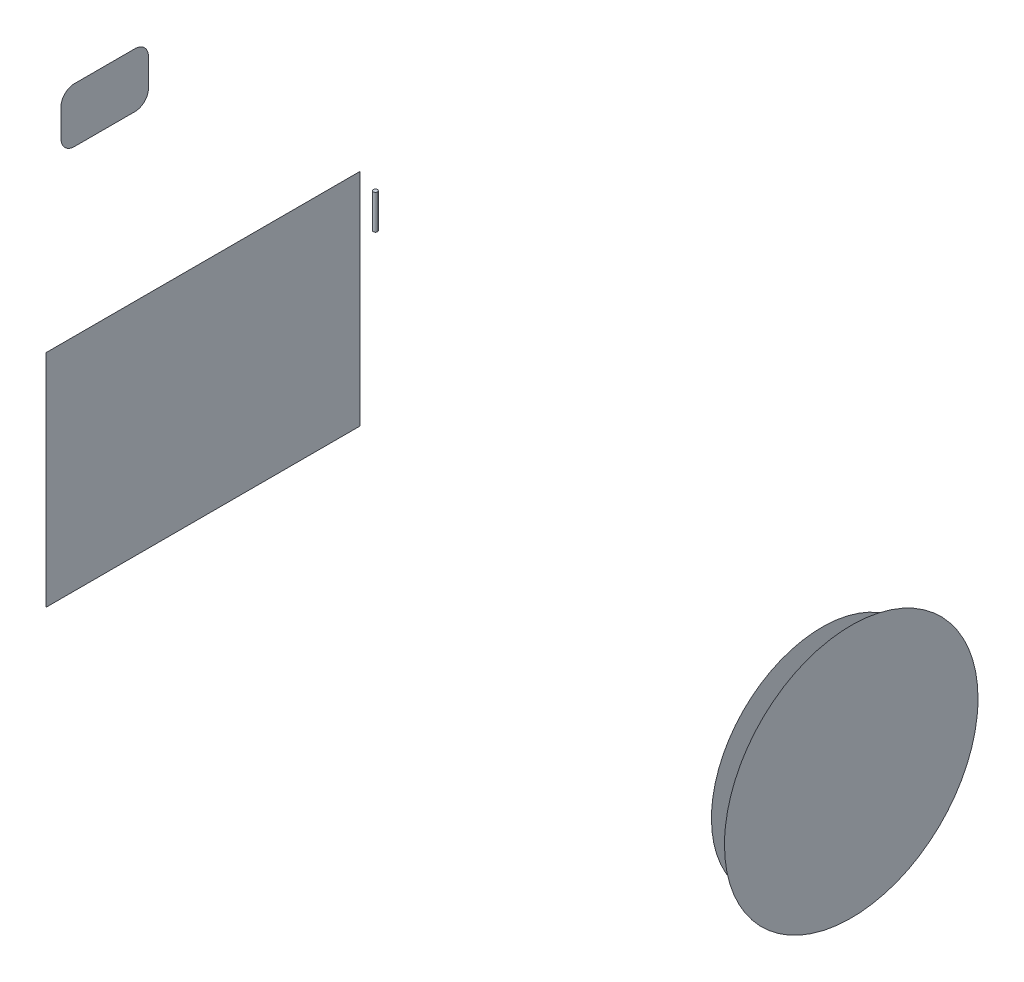
ISO-10303-21;
HEADER;
FILE_DESCRIPTION(('STEP AP214'),'2;1');
FILE_NAME('part.step','',(''),(''),'','','');
FILE_SCHEMA(('AUTOMOTIVE_DESIGN { 1 0 10303 214 1 1 1 1 }'));
ENDSEC;
DATA;
#1=APPLICATION_CONTEXT('core data for automotive mechanical design processes');
#2=APPLICATION_PROTOCOL_DEFINITION('international standard','automotive_design',2000,#1);
#3=PRODUCT_CONTEXT('',#1,'mechanical');
#4=PRODUCT('Part','Part','',(#3));
#5=PRODUCT_RELATED_PRODUCT_CATEGORY('part','',(#4));
#6=PRODUCT_DEFINITION_FORMATION('','',#4);
#7=PRODUCT_DEFINITION_CONTEXT('part definition',#1,'design');
#8=PRODUCT_DEFINITION('design','',#6,#7);
#9=PRODUCT_DEFINITION_SHAPE('','',#8);
#10=(LENGTH_UNIT() NAMED_UNIT(*) SI_UNIT(.MILLI.,.METRE.));
#11=(NAMED_UNIT(*) PLANE_ANGLE_UNIT() SI_UNIT($,.RADIAN.));
#12=(NAMED_UNIT(*) SI_UNIT($,.STERADIAN.) SOLID_ANGLE_UNIT());
#13=UNCERTAINTY_MEASURE_WITH_UNIT(LENGTH_MEASURE(1.E-05),#10,'distance_accuracy_value','');
#14=(GEOMETRIC_REPRESENTATION_CONTEXT(3) GLOBAL_UNCERTAINTY_ASSIGNED_CONTEXT((#13)) GLOBAL_UNIT_ASSIGNED_CONTEXT((#10,
#11,#12)) REPRESENTATION_CONTEXT('',''));
#15=CARTESIAN_POINT('',(0.,0.,0.));
#16=DIRECTION('',(0.,0.,1.));
#17=DIRECTION('',(1.,0.,0.));
#18=AXIS2_PLACEMENT_3D('',#15,#16,#17);
#19=CARTESIAN_POINT('',(-31.5001634156,30.4644462338,-89.9604729362));
#20=DIRECTION('',(-1.,0.,0.));
#21=DIRECTION('',(0.,-1.,0.));
#22=AXIS2_PLACEMENT_3D('',#19,#20,#21);
#23=PLANE('',#22);
#24=DIRECTION('',(0.,0.,-1.));
#25=VECTOR('',#24,1.);
#26=CARTESIAN_POINT('',(-31.5001634156,30.4644462338,-31.1921359519));
#27=LINE('',#26,#25);
#28=CARTESIAN_POINT('',(-31.5001634156,30.4644462338,27.5762010324));
#29=VERTEX_POINT('',#28);
#30=CARTESIAN_POINT('',(-31.5001634156,30.4644462338,-89.9604729362));
#31=VERTEX_POINT('',#30);
#32=EDGE_CURVE('P0_E24',#29,#31,#27,.T.);
#33=ORIENTED_EDGE('',*,*,#32,.T.);
#34=DIRECTION('',(0.,-1.,0.));
#35=VECTOR('',#34,1.);
#36=CARTESIAN_POINT('',(-31.5001634156,-10.8440817027,-89.9604729362));
#37=LINE('',#36,#35);
#38=CARTESIAN_POINT('',(-31.5001634156,-52.1526096392,-89.9604729362));
#39=VERTEX_POINT('',#38);
#40=EDGE_CURVE('P0_E11',#31,#39,#37,.T.);
#41=ORIENTED_EDGE('',*,*,#40,.T.);
#42=DIRECTION('',(0.,0.,1.));
#43=VECTOR('',#42,1.);
#44=CARTESIAN_POINT('',(-31.5001634156,-52.1526096392,-31.1921359519));
#45=LINE('',#44,#43);
#46=CARTESIAN_POINT('',(-31.5001634156,-52.1526096392,27.5762010324));
#47=VERTEX_POINT('',#46);
#48=EDGE_CURVE('P0_E18',#39,#47,#45,.T.);
#49=ORIENTED_EDGE('',*,*,#48,.T.);
#50=DIRECTION('',(0.,1.,0.));
#51=VECTOR('',#50,1.);
#52=CARTESIAN_POINT('',(-31.5001634156,-10.8440817027,27.5762010324));
#53=LINE('',#52,#51);
#54=EDGE_CURVE('P0_E38',#47,#29,#53,.T.);
#55=ORIENTED_EDGE('',*,*,#54,.T.);
#56=EDGE_LOOP('',(#33,#41,#49,#55));
#57=FACE_BOUND('',#56,.T.);
#58=ADVANCED_FACE('P0_F17',(#57),#23,.T.);
#59=OPEN_SHELL('',(#58));
#60=SHELL_BASED_SURFACE_MODEL('P0_B1',(#59));
#61=CARTESIAN_POINT('',(-32.274944086,21.3204462338,-96.577253632));
#62=DIRECTION('',(0.,-1.,0.));
#63=DIRECTION('',(1.,0.,0.));
#64=AXIS2_PLACEMENT_3D('',#61,#62,#63);
#65=PLANE('',#64);
#66=CARTESIAN_POINT('',(-31.5001634156,21.3204462338,-95.8024729362));
#67=DIRECTION('',(0.,1.,0.));
#68=DIRECTION('',(0.,0.,1.));
#69=AXIS2_PLACEMENT_3D('',#66,#67,#68);
#70=CIRCLE('',#69,0.765593566599998);
#71=CARTESIAN_POINT('',(-31.5001634156,21.3204462338,-95.0368793696));
#72=VERTEX_POINT('',#71);
#73=EDGE_CURVE('P1_E19',#72,#72,#70,.T.);
#74=ORIENTED_EDGE('',*,*,#73,.T.);
#75=EDGE_LOOP('',(#74));
#76=FACE_BOUND('',#75,.T.);
#77=ADVANCED_FACE('P1_F15',(#76),#65,.F.);
#78=CARTESIAN_POINT('',(-32.274944086,8.3664462338,-96.577253632));
#79=DIRECTION('',(0.,-1.,0.));
#80=DIRECTION('',(1.,0.,0.));
#81=AXIS2_PLACEMENT_3D('',#78,#79,#80);
#82=PLANE('',#81);
#83=CARTESIAN_POINT('',(-31.5001634156,8.3664462338,-95.8024729362));
#84=DIRECTION('',(0.,1.,0.));
#85=DIRECTION('',(0.,0.,1.));
#86=AXIS2_PLACEMENT_3D('',#83,#84,#85);
#87=CIRCLE('',#86,0.765593566599998);
#88=CARTESIAN_POINT('',(-31.5001634156,8.3664462338,-95.0368793696));
#89=VERTEX_POINT('',#88);
#90=EDGE_CURVE('P1_E10',#89,#89,#87,.F.);
#91=ORIENTED_EDGE('',*,*,#90,.T.);
#92=EDGE_LOOP('',(#91));
#93=FACE_BOUND('',#92,.T.);
#94=ADVANCED_FACE('P1_F17',(#93),#82,.T.);
#95=CARTESIAN_POINT('',(-31.5001634156,8.3664462338,-95.8024729362));
#96=DIRECTION('',(0.,1.,0.));
#97=DIRECTION('',(0.,0.,1.));
#98=AXIS2_PLACEMENT_3D('',#95,#96,#97);
#99=CYLINDRICAL_SURFACE('',#98,0.765593566599998);
#100=ORIENTED_EDGE('',*,*,#73,.F.);
#101=EDGE_LOOP('',(#100));
#102=FACE_BOUND('',#101,.T.);
#103=ORIENTED_EDGE('',*,*,#90,.F.);
#104=EDGE_LOOP('',(#103));
#105=FACE_BOUND('',#104,.T.);
#106=ADVANCED_FACE('P1_F29',(#102,#105),#99,.T.);
#107=CLOSED_SHELL('',(#77,#94,#106));
#108=MANIFOLD_SOLID_BREP('P1_B1',#107);
#109=CARTESIAN_POINT('',(-54.864,68.629559718,-1.3856896086));
#110=DIRECTION('',(1.,0.,0.));
#111=DIRECTION('',(0.,0.,-1.));
#112=AXIS2_PLACEMENT_3D('',#109,#110,#111);
#113=PLANE('',#112);
#114=CARTESIAN_POINT('',(-54.864,89.0542077688,-6.46568962263782));
#115=CARTESIAN_POINT('',(-54.864,89.0542077688,-5.96562843291567));
#116=CARTESIAN_POINT('',(-54.864,88.9565969868892,-5.47463076399726));
#117=CARTESIAN_POINT('',(-54.864,88.859145031969,-4.98443201995855));
#118=CARTESIAN_POINT('',(-54.864,88.6675157911684,-4.5216577689717));
#119=CARTESIAN_POINT('',(-54.864,88.4763033300983,-4.05989001849006));
#120=CARTESIAN_POINT('',(-54.864,88.1980733928082,-3.64339281669767));
#121=CARTESIAN_POINT('',(-54.864,87.9204486275945,-3.22780152919645));
#122=CARTESIAN_POINT('',(-54.864,87.5663102094185,-2.87358714658831));
#123=CARTESIAN_POINT('',(-54.864,87.2129421234545,-2.52014326143209));
#124=CARTESIAN_POINT('',(-54.864,86.7965045503705,-2.24182397288794));
#125=CARTESIAN_POINT('',(-54.864,86.38097278854,-1.96411006858363));
#126=CARTESIAN_POINT('',(-54.864,85.9182395984487,-1.77238157168807));
#127=CARTESIAN_POINT('',(-54.864,85.4565128780241,-1.5810700946227));
#128=CARTESIAN_POINT('',(-54.864,84.9652665943657,-1.4833003788041));
#129=CARTESIAN_POINT('',(-54.864,84.474818936762,-1.3856896086));
#130=CARTESIAN_POINT('',(-54.864,83.9742077694869,-1.3856896086));
#131=B_SPLINE_CURVE_WITH_KNOTS('',2,(#114,#115,#116,#117,#118,#119,#120,#121,#122,#123,#124,
#125,#126,#127,#128,#129,#130),.UNSPECIFIED.,.F.,.F.,(3,2,2,2,2,2,2,2,3),(0.,0.125,0.25,0.375,
0.5,0.625,0.75,0.875,1.),.UNSPECIFIED.);
#132=CARTESIAN_POINT('',(-54.864,89.0542077688,-6.46568962263782));
#133=VERTEX_POINT('',#132);
#134=CARTESIAN_POINT('',(-54.864,83.9742077694869,-1.3856896086));
#135=VERTEX_POINT('',#134);
#136=EDGE_CURVE('P2_E26',#133,#135,#131,.T.);
#137=ORIENTED_EDGE('',*,*,#136,.T.);
#138=DIRECTION('',(0.,-1.,0.));
#139=VECTOR('',#138,1.);
#140=CARTESIAN_POINT('',(-54.864,78.8418837434,-1.3856896086));
#141=LINE('',#140,#139);
#142=CARTESIAN_POINT('',(-54.864,73.7095597173131,-1.3856896086));
#143=VERTEX_POINT('',#142);
#144=EDGE_CURVE('P2_E11',#135,#143,#141,.T.);
#145=ORIENTED_EDGE('',*,*,#144,.T.);
#146=CARTESIAN_POINT('',(-54.864,73.7095597173131,-1.3856896086));
#147=CARTESIAN_POINT('',(-54.864,73.2094985356016,-1.3856896086));
#148=CARTESIAN_POINT('',(-54.864,72.7185008924344,-1.4833003788041));
#149=CARTESIAN_POINT('',(-54.864,72.2283021665695,-1.5807523235346));
#150=CARTESIAN_POINT('',(-54.864,71.7655278883513,-1.77238157168807));
#151=CARTESIAN_POINT('',(-54.864,71.303760150401,-1.96359402365416));
#152=CARTESIAN_POINT('',(-54.864,70.8872629364295,-2.24182397288794));
#153=CARTESIAN_POINT('',(-54.864,70.4716716264421,-2.51944875692242));
#154=CARTESIAN_POINT('',(-54.864,70.1174572773815,-2.8735871465883));
#155=CARTESIAN_POINT('',(-54.864,69.7640133682248,-3.22695526156698));
#156=CARTESIAN_POINT('',(-54.864,69.4856940939918,-3.64339281669767));
#157=CARTESIAN_POINT('',(-54.864,69.2079801861202,-4.05892458731823));
#158=CARTESIAN_POINT('',(-54.864,69.0162516956317,-4.5216577689717));
#159=CARTESIAN_POINT('',(-54.864,68.8249402006971,-4.98338453953347));
#160=CARTESIAN_POINT('',(-54.864,68.7271704999109,-5.47463076399726));
#161=CARTESIAN_POINT('',(-54.864,68.629559718,-5.96507849673081));
#162=CARTESIAN_POINT('',(-54.864,68.629559718,-6.46568962263782));
#163=B_SPLINE_CURVE_WITH_KNOTS('',2,(#146,#147,#148,#149,#150,#151,#152,#153,#154,#155,#156,
#157,#158,#159,#160,#161,#162),.UNSPECIFIED.,.F.,.F.,(3,2,2,2,2,2,2,2,3),(0.,0.125,0.25,0.375,
0.5,0.625,0.75,0.875,1.),.UNSPECIFIED.);
#164=CARTESIAN_POINT('',(-54.864,68.629559718,-6.46568962263782));
#165=VERTEX_POINT('',#164);
#166=EDGE_CURVE('P2_E51',#143,#165,#163,.T.);
#167=ORIENTED_EDGE('',*,*,#166,.T.);
#168=DIRECTION('',(0.,0.,-1.));
#169=VECTOR('',#168,1.);
#170=CARTESIAN_POINT('',(-54.864,68.629559718,-17.7800050038));
#171=LINE('',#170,#169);
#172=CARTESIAN_POINT('',(-54.864,68.629559718,-29.0943203849622));
#173=VERTEX_POINT('',#172);
#174=EDGE_CURVE('P2_E53',#165,#173,#171,.T.);
#175=ORIENTED_EDGE('',*,*,#174,.T.);
#176=CARTESIAN_POINT('',(-54.864,68.629559718,-29.0943203849622));
#177=CARTESIAN_POINT('',(-54.864,68.629559718,-29.5943815746867));
#178=CARTESIAN_POINT('',(-54.864,68.7271704999109,-30.0853792436027));
#179=CARTESIAN_POINT('',(-54.864,68.8246224548328,-30.5755779876483));
#180=CARTESIAN_POINT('',(-54.864,69.0162516956317,-31.0383522386283));
#181=CARTESIAN_POINT('',(-54.864,69.2074641567029,-31.5001199891106));
#182=CARTESIAN_POINT('',(-54.864,69.4856940939918,-31.9166171909023));
#183=CARTESIAN_POINT('',(-54.864,69.7633188591961,-32.3322084783905));
#184=CARTESIAN_POINT('',(-54.864,70.1174572773815,-32.6864228610117));
#185=CARTESIAN_POINT('',(-54.864,70.4708253633129,-33.0398667461389));
#186=CARTESIAN_POINT('',(-54.864,70.8872629364295,-33.3181860347121));
#187=CARTESIAN_POINT('',(-54.864,71.302794698242,-33.5958999390115));
#188=CARTESIAN_POINT('',(-54.864,71.7655278883513,-33.7876284359119));
#189=CARTESIAN_POINT('',(-54.864,72.2272546087883,-33.9789399129798));
#190=CARTESIAN_POINT('',(-54.864,72.7185008924344,-34.0767096287959));
#191=CARTESIAN_POINT('',(-54.864,73.208948550038,-34.174320399));
#192=CARTESIAN_POINT('',(-54.864,73.7095597173131,-34.174320399));
#193=B_SPLINE_CURVE_WITH_KNOTS('',2,(#176,#177,#178,#179,#180,#181,#182,#183,#184,#185,#186,
#187,#188,#189,#190,#191,#192),.UNSPECIFIED.,.F.,.F.,(3,2,2,2,2,2,2,2,3),(0.,0.125,0.25,0.375,
0.5,0.625,0.75,0.875,1.),.UNSPECIFIED.);
#194=CARTESIAN_POINT('',(-54.864,73.7095597173131,-34.174320399));
#195=VERTEX_POINT('',#194);
#196=EDGE_CURVE('P2_E58',#173,#195,#193,.T.);
#197=ORIENTED_EDGE('',*,*,#196,.T.);
#198=DIRECTION('',(0.,1.,0.));
#199=VECTOR('',#198,1.);
#200=CARTESIAN_POINT('',(-54.864,78.8418837434,-34.174320399));
#201=LINE('',#200,#199);
#202=CARTESIAN_POINT('',(-54.864,83.9742077694869,-34.174320399));
#203=VERTEX_POINT('',#202);
#204=EDGE_CURVE('P2_E64',#195,#203,#201,.T.);
#205=ORIENTED_EDGE('',*,*,#204,.T.);
#206=CARTESIAN_POINT('',(-54.864,83.9742077694869,-34.174320399));
#207=CARTESIAN_POINT('',(-54.864,84.4742689512014,-34.174320399));
#208=CARTESIAN_POINT('',(-54.864,84.9652665943657,-34.0767096287959));
#209=CARTESIAN_POINT('',(-54.864,85.4554653202225,-33.9792576840664));
#210=CARTESIAN_POINT('',(-54.864,85.9182395984487,-33.7876284359119));
#211=CARTESIAN_POINT('',(-54.864,86.3800073364008,-33.5964159839474));
#212=CARTESIAN_POINT('',(-54.864,86.7965045503705,-33.3181860347121));
#213=CARTESIAN_POINT('',(-54.864,87.2120958603615,-33.0405612506725));
#214=CARTESIAN_POINT('',(-54.864,87.5663102094185,-32.6864228610117));
#215=CARTESIAN_POINT('',(-54.864,87.9197541185672,-32.3330547460426));
#216=CARTESIAN_POINT('',(-54.864,88.1980733928082,-31.9166171909023));
#217=CARTESIAN_POINT('',(-54.864,88.475787300696,-31.50108542026));
#218=CARTESIAN_POINT('',(-54.864,88.6675157911684,-31.0383522386283));
#219=CARTESIAN_POINT('',(-54.864,88.8588272861095,-30.5766254680335));
#220=CARTESIAN_POINT('',(-54.864,88.9565969868892,-30.0853792436027));
#221=CARTESIAN_POINT('',(-54.864,89.0542077688,-29.5949315108691));
#222=CARTESIAN_POINT('',(-54.864,89.0542077688,-29.0943203849622));
#223=B_SPLINE_CURVE_WITH_KNOTS('',2,(#206,#207,#208,#209,#210,#211,#212,#213,#214,#215,#216,
#217,#218,#219,#220,#221,#222),.UNSPECIFIED.,.F.,.F.,(3,2,2,2,2,2,2,2,3),(0.,0.125,0.25,0.375,
0.5,0.625,0.75,0.875,1.),.UNSPECIFIED.);
#224=CARTESIAN_POINT('',(-54.864,89.0542077688,-29.0943203849622));
#225=VERTEX_POINT('',#224);
#226=EDGE_CURVE('P2_E19',#203,#225,#223,.T.);
#227=ORIENTED_EDGE('',*,*,#226,.T.);
#228=DIRECTION('',(0.,0.,1.));
#229=VECTOR('',#228,1.);
#230=CARTESIAN_POINT('',(-54.864,89.0542077688,-17.7800050038));
#231=LINE('',#230,#229);
#232=EDGE_CURVE('P2_E70',#225,#133,#231,.T.);
#233=ORIENTED_EDGE('',*,*,#232,.T.);
#234=EDGE_LOOP('',(#137,#145,#167,#175,#197,#205,#227,#233));
#235=FACE_BOUND('',#234,.T.);
#236=ADVANCED_FACE('P2_F17',(#235),#113,.T.);
#237=OPEN_SHELL('',(#236));
#238=SHELL_BASED_SURFACE_MODEL('P2_B1',(#237));
#239=CARTESIAN_POINT('',(224.7714254372,-48.0521122776,30.2721122776));
#240=DIRECTION('',(1.,0.,0.));
#241=DIRECTION('',(0.,0.,-1.));
#242=AXIS2_PLACEMENT_3D('',#239,#240,#241);
#243=PLANE('',#242);
#244=CARTESIAN_POINT('',(224.7714254372,0.,-65.262324361429));
#245=CARTESIAN_POINT('',(224.7714254372,2.33238198648042,-65.262324361429));
#246=CARTESIAN_POINT('',(224.7714254372,4.6540816644977,-65.0336840501446));
#247=CARTESIAN_POINT('',(224.7714254372,6.97496196029871,-64.8051244313834));
#248=CARTESIAN_POINT('',(224.7714254372,9.26334195243467,-64.3499648640761));
#249=CARTESIAN_POINT('',(224.7714254372,11.5506437984273,-63.8950197404074));
#250=CARTESIAN_POINT('',(224.7714254372,13.7833911874269,-63.2177514802731));
#251=CARTESIAN_POINT('',(224.7714254372,16.0150866858227,-62.5408022943531));
#252=CARTESIAN_POINT('',(224.7714254372,18.1706988648579,-61.6479476918451));
#253=CARTESIAN_POINT('',(224.7714254372,20.3252963520494,-60.7555133747165));
#254=CARTESIAN_POINT('',(224.7714254372,22.3830127624019,-59.6556715582527));
#255=CARTESIAN_POINT('',(224.7714254372,24.4397613892376,-58.5563470185019));
#256=CARTESIAN_POINT('',(224.7714254372,26.3797660375193,-57.2601098074073));
#257=CARTESIAN_POINT('',(224.7714254372,28.3188577468641,-55.9644825873363));
#258=CARTESIAN_POINT('',(224.7714254372,30.1224676989208,-54.4843331233512));
#259=CARTESIAN_POINT('',(224.7714254372,31.9252284214839,-53.0048805875341));
#260=CARTESIAN_POINT('',(224.7714254372,33.5750735688743,-51.3550735688743));
#261=CARTESIAN_POINT('',(224.7714254372,35.2241422263636,-49.7060430221703));
#262=CARTESIAN_POINT('',(224.7714254372,36.7043331233513,-47.9024676989208));
#263=CARTESIAN_POINT('',(224.7714254372,38.183827340864,-46.0997412620626));
#264=CARTESIAN_POINT('',(224.7714254372,39.4801098074073,-44.1597660375193));
#265=CARTESIAN_POINT('',(224.7714254372,40.7757819300022,-42.2207042343704));
#266=CARTESIAN_POINT('',(224.7714254372,41.8756715582527,-40.1630127624019));
#267=CARTESIAN_POINT('',(224.7714254372,42.9750436308497,-38.1062895419991));
#268=CARTESIAN_POINT('',(224.7714254372,43.8679476918451,-35.9506988648579));
#269=CARTESIAN_POINT('',(224.7714254372,44.760431802836,-33.7961220035948));
#270=CARTESIAN_POINT('',(224.7714254372,45.4377514802731,-31.5633911874269));
#271=CARTESIAN_POINT('',(224.7714254372,46.1147523217887,-29.3317113886899));
#272=CARTESIAN_POINT('',(224.7714254372,46.5699648640761,-27.0433419524347));
#273=CARTESIAN_POINT('',(224.7714254372,47.0249629375726,-24.7560506583233));
#274=CARTESIAN_POINT('',(224.7714254372,47.2536840501447,-22.4340816644977));
#275=CARTESIAN_POINT('',(224.7714254372,47.4822974003584,-20.1132066704865));
#276=CARTESIAN_POINT('',(224.7714254372,47.482324361429,-17.78));
#277=CARTESIAN_POINT('',(224.7714254372,47.4823513098081,-15.4478916573299));
#278=CARTESIAN_POINT('',(224.7714254372,47.2536840501447,-13.1259183355023));
#279=CARTESIAN_POINT('',(224.7714254372,47.0251244313809,-10.8050380398372));
#280=CARTESIAN_POINT('',(224.7714254372,46.5699648640761,-8.51665804756533));
#281=CARTESIAN_POINT('',(224.7714254372,46.1150197404815,-6.22935620179603));
#282=CARTESIAN_POINT('',(224.7714254372,45.4377514802731,-3.99660881257312));
#283=CARTESIAN_POINT('',(224.7714254372,44.7608022944074,-1.76491331437674));
#284=CARTESIAN_POINT('',(224.7714254372,43.8679476918451,0.390698864857854));
#285=CARTESIAN_POINT('',(224.7714254372,42.9755133748627,2.54529635176496));
#286=CARTESIAN_POINT('',(224.7714254372,41.8756715582527,4.60301276240186));
#287=CARTESIAN_POINT('',(224.7714254372,40.7763470186092,6.6597613890478));
#288=CARTESIAN_POINT('',(224.7714254372,39.4801098074073,8.59976603751926));
#289=CARTESIAN_POINT('',(224.7714254372,38.1844825875141,10.5388577466272));
#290=CARTESIAN_POINT('',(224.7714254372,36.7043331233513,12.3424676989208));
#291=CARTESIAN_POINT('',(224.7714254372,35.2248805876266,14.1452284213914));
#292=CARTESIAN_POINT('',(224.7714254372,33.5750735688743,15.7950735688743));
#293=CARTESIAN_POINT('',(224.7714254372,31.9260430221462,17.4441422263877));
#294=CARTESIAN_POINT('',(224.7714254372,30.1224676989208,18.9243331233512));
#295=CARTESIAN_POINT('',(224.7714254372,28.3197412623582,20.4038273406171));
#296=CARTESIAN_POINT('',(224.7714254372,26.3797660375193,21.7001098074073));
#297=CARTESIAN_POINT('',(224.7714254372,24.4407042347852,22.9957819297743));
#298=CARTESIAN_POINT('',(224.7714254372,22.3830127624019,24.0956715582527));
#299=CARTESIAN_POINT('',(224.7714254372,20.3262895421894,25.195043630754));
#300=CARTESIAN_POINT('',(224.7714254372,18.1706988648579,26.0879476918451));
#301=CARTESIAN_POINT('',(224.7714254372,16.0161220037651,26.9804318027823));
#302=CARTESIAN_POINT('',(224.7714254372,13.7833911874269,27.6577514802731));
#303=CARTESIAN_POINT('',(224.7714254372,11.5517113884119,28.3347523218751));
#304=CARTESIAN_POINT('',(224.7714254372,9.26334195243467,28.7899648640761));
#305=CARTESIAN_POINT('',(224.7714254372,6.97605065787951,29.2449629376298));
#306=CARTESIAN_POINT('',(224.7714254372,4.6540816644977,29.4736840501447));
#307=CARTESIAN_POINT('',(224.7714254372,2.33293296247308,29.702324361429));
#308=CARTESIAN_POINT('',(224.7714254372,0.,29.702324361429));
#309=B_SPLINE_CURVE_WITH_KNOTS('',2,(#244,#245,#246,#247,#248,#249,#250,#251,#252,#253,#254,
#255,#256,#257,#258,#259,#260,#261,#262,#263,#264,#265,#266,#267,#268,#269,#270,#271,#272,#273,
#274,#275,#276,#277,#278,#279,#280,#281,#282,#283,#284,#285,#286,#287,#288,#289,#290,#291,#292,
#293,#294,#295,#296,#297,#298,#299,#300,#301,#302,#303,#304,#305,#306,#307,#308),.UNSPECIFIED.,
.F.,.F.,(3,2,2,2,2,2,2,2,2,2,2,2,2,2,2,2,2,2,2,2,2,2,2,2,2,2,2,2,2,2,2,2,3),(0.,0.03125,0.0625,
0.09375,0.125,0.15625,0.1875,0.21875,0.25,0.28125,0.3125,0.34375,0.375,0.40625,0.4375,0.46875,
0.5,0.53125,0.5625,0.59375,0.625,0.65625,0.6875,0.71875,0.75,0.78125,0.8125,0.84375,0.875,
0.90625,0.9375,0.96875,1.),.UNSPECIFIED.);
#310=CARTESIAN_POINT('',(224.7714254372,0.,-65.262324361429));
#311=VERTEX_POINT('',#310);
#312=CARTESIAN_POINT('',(224.7714254372,0.,29.702324361429));
#313=VERTEX_POINT('',#312);
#314=EDGE_CURVE('P3_E24',#311,#313,#309,.T.);
#315=ORIENTED_EDGE('',*,*,#314,.T.);
#316=CARTESIAN_POINT('',(224.7714254372,0.,29.702324361429));
#317=CARTESIAN_POINT('',(224.7714254372,-2.33238198649503,29.702324361429));
#318=CARTESIAN_POINT('',(224.7714254372,-4.6540816644977,29.4736840501447));
#319=CARTESIAN_POINT('',(224.7714254372,-6.97496196024005,29.2451244313878));
#320=CARTESIAN_POINT('',(224.7714254372,-9.26334195243467,28.7899648640761));
#321=CARTESIAN_POINT('',(224.7714254372,-11.5506437983994,28.3350197404203));
#322=CARTESIAN_POINT('',(224.7714254372,-13.7833911874269,27.6577514802731));
#323=CARTESIAN_POINT('',(224.7714254372,-16.0150866856203,26.9808022944101));
#324=CARTESIAN_POINT('',(224.7714254372,-18.1706988648579,26.0879476918451));
#325=CARTESIAN_POINT('',(224.7714254372,-20.325296351544,25.1955133749528));
#326=CARTESIAN_POINT('',(224.7714254372,-22.3830127624019,24.0956715582527));
#327=CARTESIAN_POINT('',(224.7714254372,-24.4397613887824,22.9963470187791));
#328=CARTESIAN_POINT('',(224.7714254372,-26.3797660375193,21.7001098074073));
#329=CARTESIAN_POINT('',(224.7714254372,-28.3188577466872,20.4044825874815));
#330=CARTESIAN_POINT('',(224.7714254372,-30.1224676989208,18.9243331233512));
#331=CARTESIAN_POINT('',(224.7714254372,-31.9252284215659,17.4448805874668));
#332=CARTESIAN_POINT('',(224.7714254372,-33.5750735688743,15.7950735688743));
#333=CARTESIAN_POINT('',(224.7714254372,-35.2241422264457,14.1460430220735));
#334=CARTESIAN_POINT('',(224.7714254372,-36.7043331233513,12.3424676989208));
#335=CARTESIAN_POINT('',(224.7714254372,-38.1838273406378,10.5397412623351));
#336=CARTESIAN_POINT('',(224.7714254372,-39.4801098074073,8.59976603751926));
#337=CARTESIAN_POINT('',(224.7714254372,-40.7757819297665,6.66070423478916));
#338=CARTESIAN_POINT('',(224.7714254372,-41.8756715582527,4.60301276240186));
#339=CARTESIAN_POINT('',(224.7714254372,-42.9750436306783,2.54628954234164));
#340=CARTESIAN_POINT('',(224.7714254372,-43.8679476918451,0.390698864857854));
#341=CARTESIAN_POINT('',(224.7714254372,-44.7604318027888,-1.76387799622025));
#342=CARTESIAN_POINT('',(224.7714254372,-45.4377514802731,-3.99660881257312));
#343=CARTESIAN_POINT('',(224.7714254372,-46.1147523219252,-6.22828861178961));
#344=CARTESIAN_POINT('',(224.7714254372,-46.5699648640761,-8.51665804756533));
#345=CARTESIAN_POINT('',(224.7714254372,-47.0249629376479,-10.8039493422617));
#346=CARTESIAN_POINT('',(224.7714254372,-47.2536840501447,-13.1259183355023));
#347=CARTESIAN_POINT('',(224.7714254372,-47.4822974003584,-15.4467933296922));
#348=CARTESIAN_POINT('',(224.7714254372,-47.482324361429,-17.78));
#349=CARTESIAN_POINT('',(224.7714254372,-47.4823513098081,-20.1121083426408));
#350=CARTESIAN_POINT('',(224.7714254372,-47.2536840501447,-22.4340816644977));
#351=CARTESIAN_POINT('',(224.7714254372,-47.0251244313578,-24.7549619604271));
#352=CARTESIAN_POINT('',(224.7714254372,-46.5699648640761,-27.0433419524347));
#353=CARTESIAN_POINT('',(224.7714254372,-46.115019740396,-29.3306437984857));
#354=CARTESIAN_POINT('',(224.7714254372,-45.4377514802731,-31.5633911874269));
#355=CARTESIAN_POINT('',(224.7714254372,-44.7608022944643,-33.7950866854357));
#356=CARTESIAN_POINT('',(224.7714254372,-43.8679476918451,-35.9506988648579));
#357=CARTESIAN_POINT('',(224.7714254372,-42.9755133750837,-38.1052963512816));
#358=CARTESIAN_POINT('',(224.7714254372,-41.8756715582527,-40.1630127624019));
#359=CARTESIAN_POINT('',(224.7714254372,-40.7763470187955,-42.219761388769));
#360=CARTESIAN_POINT('',(224.7714254372,-39.4801098074073,-44.1597660375193));
#361=CARTESIAN_POINT('',(224.7714254372,-38.1844825874232,-46.0988577467633));
#362=CARTESIAN_POINT('',(224.7714254372,-36.7043331233513,-47.9024676989208));
#363=CARTESIAN_POINT('',(224.7714254372,-35.224880587511,-49.705228421507));
#364=CARTESIAN_POINT('',(224.7714254372,-33.5750735688743,-51.3550735688743));
#365=CARTESIAN_POINT('',(224.7714254372,-31.926043022221,-53.0041422263129));
#366=CARTESIAN_POINT('',(224.7714254372,-30.1224676989208,-54.4843331233512));
#367=CARTESIAN_POINT('',(224.7714254372,-28.3197412624459,-55.9638273405585));
#368=CARTESIAN_POINT('',(224.7714254372,-26.3797660375193,-57.2601098074073));
#369=CARTESIAN_POINT('',(224.7714254372,-24.440704234565,-58.5557819299215));
#370=CARTESIAN_POINT('',(224.7714254372,-22.3830127624019,-59.6556715582527));
#371=CARTESIAN_POINT('',(224.7714254372,-20.3262895421687,-60.7550436307357));
#372=CARTESIAN_POINT('',(224.7714254372,-18.1706988648579,-61.6479476918451));
#373=CARTESIAN_POINT('',(224.7714254372,-16.0161220036355,-62.5404318028628));
#374=CARTESIAN_POINT('',(224.7714254372,-13.7833911874269,-63.2177514802731));
#375=CARTESIAN_POINT('',(224.7714254372,-11.5517113874959,-63.8947523221117));
#376=CARTESIAN_POINT('',(224.7714254372,-9.26334195243467,-64.3499648640761));
#377=CARTESIAN_POINT('',(224.7714254372,-6.97605065732284,-64.8049629376861));
#378=CARTESIAN_POINT('',(224.7714254372,-4.6540816644977,-65.0336840501446));
#379=CARTESIAN_POINT('',(224.7714254372,-2.33293296245847,-65.262324361429));
#380=CARTESIAN_POINT('',(224.7714254372,0.,-65.262324361429));
#381=B_SPLINE_CURVE_WITH_KNOTS('',2,(#316,#317,#318,#319,#320,#321,#322,#323,#324,#325,#326,
#327,#328,#329,#330,#331,#332,#333,#334,#335,#336,#337,#338,#339,#340,#341,#342,#343,#344,#345,
#346,#347,#348,#349,#350,#351,#352,#353,#354,#355,#356,#357,#358,#359,#360,#361,#362,#363,#364,
#365,#366,#367,#368,#369,#370,#371,#372,#373,#374,#375,#376,#377,#378,#379,#380),.UNSPECIFIED.,
.F.,.F.,(3,2,2,2,2,2,2,2,2,2,2,2,2,2,2,2,2,2,2,2,2,2,2,2,2,2,2,2,2,2,2,2,3),(0.,0.03125,0.0625,
0.09375,0.125,0.15625,0.1875,0.21875,0.25,0.28125,0.3125,0.34375,0.375,0.40625,0.4375,0.46875,
0.5,0.53125,0.5625,0.59375,0.625,0.65625,0.6875,0.71875,0.75,0.78125,0.8125,0.84375,0.875,
0.90625,0.9375,0.96875,1.),.UNSPECIFIED.);
#382=EDGE_CURVE('P3_E11',#313,#311,#381,.T.);
#383=ORIENTED_EDGE('',*,*,#382,.T.);
#384=EDGE_LOOP('',(#315,#383));
#385=FACE_BOUND('',#384,.T.);
#386=ADVANCED_FACE('P3_F17',(#385),#243,.T.);
#387=OPEN_SHELL('',(#386));
#388=SHELL_BASED_SURFACE_MODEL('P3_B1',(#387));
#389=CARTESIAN_POINT('',(213.7949933896,-41.8828716316,24.1028716316));
#390=DIRECTION('',(1.,0.,0.));
#391=DIRECTION('',(0.,0.,-1.));
#392=AXIS2_PLACEMENT_3D('',#389,#390,#391);
#393=PLANE('',#392);
#394=CARTESIAN_POINT('',(213.7949933896,0.,-59.166236769591));
#395=CARTESIAN_POINT('',(213.7949933896,2.03290040232451,-59.166236769591));
#396=CARTESIAN_POINT('',(213.7949933896,4.05656058969976,-58.9669507787482));
#397=CARTESIAN_POINT('',(213.7949933896,6.07940151343619,-58.7677454673431));
#398=CARTESIAN_POINT('',(213.7949933896,8.07405426075921,-58.3710118793979));
#399=CARTESIAN_POINT('',(213.7949933896,10.0676291025021,-57.974492685336));
#400=CARTESIAN_POINT('',(213.7949933896,12.0137903702568,-57.3841593652056));
#401=CARTESIAN_POINT('',(213.7949933896,13.9588999752974,-56.7941450482081));
#402=CARTESIAN_POINT('',(213.7949933896,15.8378271410156,-56.0158971298703));
#403=CARTESIAN_POINT('',(213.7949933896,17.7157397241116,-55.2380694496493));
#404=CARTESIAN_POINT('',(213.7949933896,19.50933696401,-54.2794022786992));
#405=CARTESIAN_POINT('',(213.7949933896,21.3019664182588,-53.3212523834842));
#406=CARTESIAN_POINT('',(213.7949933896,22.992961230054,-52.1913982235059));
#407=CARTESIAN_POINT('',(213.7949933896,24.6830431675367,-51.0621540091243));
#408=CARTESIAN_POINT('',(213.7949933896,26.255150670016,-49.7719936848525));
#409=CARTESIAN_POINT('',(213.7949933896,27.8264090646206,-48.4825301865225));
#410=CARTESIAN_POINT('',(213.7949933896,29.2644886905879,-47.0444886905879));
#411=CARTESIAN_POINT('',(213.7949933896,30.7017918941771,-45.607223596445));
#412=CARTESIAN_POINT('',(213.7949933896,31.9919936848525,-44.0351506700161));
#413=CARTESIAN_POINT('',(213.7949933896,33.2814988605477,-42.4639265484473));
#414=CARTESIAN_POINT('',(213.7949933896,34.4113982235059,-40.772961230054));
#415=CARTESIAN_POINT('',(213.7949933896,35.5406873274539,-39.0829092025743));
#416=CARTESIAN_POINT('',(213.7949933896,36.4994022786992,-37.28933696401));
#417=CARTESIAN_POINT('',(213.7949933896,37.4575997053691,-35.4967329149058));
#418=CARTESIAN_POINT('',(213.7949933896,38.2358971298703,-33.6178271410156));
#419=CARTESIAN_POINT('',(213.7949933896,39.0137746025151,-31.7399351825933));
#420=CARTESIAN_POINT('',(213.7949933896,39.6041593652056,-29.7937903702568));
#421=CARTESIAN_POINT('',(213.7949933896,40.1942253261399,-27.8486964562886));
#422=CARTESIAN_POINT('',(213.7949933896,40.5910118793979,-25.8540542607592));
#423=CARTESIAN_POINT('',(213.7949933896,40.9875840102379,-23.8604899646674));
#424=CARTESIAN_POINT('',(213.7949933896,41.1869507787482,-21.8365605896998));
#425=CARTESIAN_POINT('',(213.7949933896,41.3862098075906,-19.8137249651111));
#426=CARTESIAN_POINT('',(213.7949933896,41.386236769591,-17.78));
#427=CARTESIAN_POINT('',(213.7949933896,41.386263717032,-15.7473732374701));
#428=CARTESIAN_POINT('',(213.7949933896,41.1869507787482,-13.7234394103002));
#429=CARTESIAN_POINT('',(213.7949933896,40.9877454674345,-11.7005984869203));
#430=CARTESIAN_POINT('',(213.7949933896,40.5910118793979,-9.7059457392408));
#431=CARTESIAN_POINT('',(213.7949933896,40.1944926852571,-7.71237089720454));
#432=CARTESIAN_POINT('',(213.7949933896,39.6041593652056,-5.76620962974326));
#433=CARTESIAN_POINT('',(213.7949933896,39.0141450480809,-3.82110002431657));
#434=CARTESIAN_POINT('',(213.7949933896,38.2358971298703,-1.94217285898443));
#435=CARTESIAN_POINT('',(213.7949933896,37.4580694494571,-0.0642602755034256));
#436=CARTESIAN_POINT('',(213.7949933896,36.4994022786992,1.72933696401003));
#437=CARTESIAN_POINT('',(213.7949933896,35.5412523833483,3.52196641848759));
#438=CARTESIAN_POINT('',(213.7949933896,34.4113982235059,5.21296123005404));
#439=CARTESIAN_POINT('',(213.7949933896,33.2821540090389,6.90304316763926));
#440=CARTESIAN_POINT('',(213.7949933896,31.9919936848525,8.47515067001603));
#441=CARTESIAN_POINT('',(213.7949933896,30.7025301865299,10.0464090646132));
#442=CARTESIAN_POINT('',(213.7949933896,29.2644886905879,11.4844886905879));
#443=CARTESIAN_POINT('',(213.7949933896,27.8272235962918,12.9217918943303));
#444=CARTESIAN_POINT('',(213.7949933896,26.255150670016,14.2119936848525));
#445=CARTESIAN_POINT('',(213.7949933896,24.6839265482672,15.5014988606681));
#446=CARTESIAN_POINT('',(213.7949933896,22.992961230054,16.6313982235059));
#447=CARTESIAN_POINT('',(213.7949933896,21.3029092028656,17.7606873272593));
#448=CARTESIAN_POINT('',(213.7949933896,19.50933696401,18.7194022786992));
#449=CARTESIAN_POINT('',(213.7949933896,17.7167329152825,19.6775997052067));
#450=CARTESIAN_POINT('',(213.7949933896,15.8378271410156,20.4558971298703));
#451=CARTESIAN_POINT('',(213.7949933896,13.9599351826512,21.2337746024976));
#452=CARTESIAN_POINT('',(213.7949933896,12.0137903702568,21.8241593652056));
#453=CARTESIAN_POINT('',(213.7949933896,10.0686964565098,22.4142253260728));
#454=CARTESIAN_POINT('',(213.7949933896,8.07405426075921,22.8110118793979));
#455=CARTESIAN_POINT('',(213.7949933896,6.08048996501268,23.2075840101924));
#456=CARTESIAN_POINT('',(213.7949933896,4.05656058969976,23.4069507787482));
#457=CARTESIAN_POINT('',(213.7949933896,2.03345125268832,23.606236769591));
#458=CARTESIAN_POINT('',(213.7949933896,0.,23.606236769591));
#459=B_SPLINE_CURVE_WITH_KNOTS('',2,(#394,#395,#396,#397,#398,#399,#400,#401,#402,#403,#404,
#405,#406,#407,#408,#409,#410,#411,#412,#413,#414,#415,#416,#417,#418,#419,#420,#421,#422,#423,
#424,#425,#426,#427,#428,#429,#430,#431,#432,#433,#434,#435,#436,#437,#438,#439,#440,#441,#442,
#443,#444,#445,#446,#447,#448,#449,#450,#451,#452,#453,#454,#455,#456,#457,#458),.UNSPECIFIED.,
.F.,.F.,(3,2,2,2,2,2,2,2,2,2,2,2,2,2,2,2,2,2,2,2,2,2,2,2,2,2,2,2,2,2,2,2,3),(0.,0.03125,0.0625,
0.09375,0.125,0.15625,0.1875,0.21875,0.25,0.28125,0.3125,0.34375,0.375,0.40625,0.4375,0.46875,
0.5,0.53125,0.5625,0.59375,0.625,0.65625,0.6875,0.71875,0.75,0.78125,0.8125,0.84375,0.875,
0.90625,0.9375,0.96875,1.),.UNSPECIFIED.);
#460=CARTESIAN_POINT('',(213.7949933896,0.,-59.166236769591));
#461=VERTEX_POINT('',#460);
#462=CARTESIAN_POINT('',(213.7949933896,0.,23.606236769591));
#463=VERTEX_POINT('',#462);
#464=EDGE_CURVE('P4_E24',#461,#463,#459,.T.);
#465=ORIENTED_EDGE('',*,*,#464,.T.);
#466=CARTESIAN_POINT('',(213.7949933896,0.,23.606236769591));
#467=CARTESIAN_POINT('',(213.7949933896,-2.03290040199891,23.606236769591));
#468=CARTESIAN_POINT('',(213.7949933896,-4.05656058969976,23.4069507787482));
#469=CARTESIAN_POINT('',(213.7949933896,-6.07940151305328,23.2077454674128));
#470=CARTESIAN_POINT('',(213.7949933896,-8.07405426075921,22.8110118793979));
#471=CARTESIAN_POINT('',(213.7949933896,-10.0676291027849,22.4144926852861));
#472=CARTESIAN_POINT('',(213.7949933896,-12.0137903702567,21.8241593652056));
#473=CARTESIAN_POINT('',(213.7949933896,-13.9588999757753,21.2341450480272));
#474=CARTESIAN_POINT('',(213.7949933896,-15.8378271410156,20.4558971298703));
#475=CARTESIAN_POINT('',(213.7949933896,-17.7157397243101,19.6780694495501));
#476=CARTESIAN_POINT('',(213.7949933896,-19.50933696401,18.7194022786992));
#477=CARTESIAN_POINT('',(213.7949933896,-21.3019664185021,17.7612523833473));
#478=CARTESIAN_POINT('',(213.7949933896,-22.992961230054,16.6313982235059));
#479=CARTESIAN_POINT('',(213.7949933896,-24.6830431677184,15.5021540089773));
#480=CARTESIAN_POINT('',(213.7949933896,-26.255150670016,14.2119936848525));
#481=CARTESIAN_POINT('',(213.7949933896,-27.826409064632,12.9225301865111));
#482=CARTESIAN_POINT('',(213.7949933896,-29.2644886905879,11.4844886905879));
#483=CARTESIAN_POINT('',(213.7949933896,-30.7017918941644,10.0472235964577));
#484=CARTESIAN_POINT('',(213.7949933896,-31.9919936848525,8.47515067001603));
#485=CARTESIAN_POINT('',(213.7949933896,-33.2814988604915,6.90392654851859));
#486=CARTESIAN_POINT('',(213.7949933896,-34.4113982235059,5.21296123005404));
#487=CARTESIAN_POINT('',(213.7949933896,-35.5406873273041,3.52290920281141));
#488=CARTESIAN_POINT('',(213.7949933896,-36.4994022786992,1.72933696401003));
#489=CARTESIAN_POINT('',(213.7949933896,-37.457599705209,-0.0632670847514338));
#490=CARTESIAN_POINT('',(213.7949933896,-38.2358971298703,-1.94217285898443));
#491=CARTESIAN_POINT('',(213.7949933896,-39.0137746024655,-3.82006481724301));
#492=CARTESIAN_POINT('',(213.7949933896,-39.6041593652056,-5.76620962974326));
#493=CARTESIAN_POINT('',(213.7949933896,-40.1942253260728,-7.71130354349029));
#494=CARTESIAN_POINT('',(213.7949933896,-40.5910118793979,-9.7059457392408));
#495=CARTESIAN_POINT('',(213.7949933896,-40.9875840102128,-11.69951003509));
#496=CARTESIAN_POINT('',(213.7949933896,-41.1869507787482,-13.7234394103002));
#497=CARTESIAN_POINT('',(213.7949933896,-41.3862098075906,-15.7462750348762));
#498=CARTESIAN_POINT('',(213.7949933896,-41.386236769591,-17.78));
#499=CARTESIAN_POINT('',(213.7949933896,-41.386263717032,-19.812626762816));
#500=CARTESIAN_POINT('',(213.7949933896,-41.1869507787482,-21.8365605896998));
#501=CARTESIAN_POINT('',(213.7949933896,-40.9877454674189,-23.8594015129519));
#502=CARTESIAN_POINT('',(213.7949933896,-40.5910118793979,-25.8540542607592));
#503=CARTESIAN_POINT('',(213.7949933896,-40.1944926853126,-27.8476291027227));
#504=CARTESIAN_POINT('',(213.7949933896,-39.6041593652056,-29.7937903702568));
#505=CARTESIAN_POINT('',(213.7949933896,-39.0141450480189,-31.7388999757776));
#506=CARTESIAN_POINT('',(213.7949933896,-38.2358971298703,-33.6178271410156));
#507=CARTESIAN_POINT('',(213.7949933896,-37.4580694495446,-35.4957397243411));
#508=CARTESIAN_POINT('',(213.7949933896,-36.4994022786992,-37.28933696401));
#509=CARTESIAN_POINT('',(213.7949933896,-35.5412523832925,-39.081966418584));
#510=CARTESIAN_POINT('',(213.7949933896,-34.4113982235059,-40.772961230054));
#511=CARTESIAN_POINT('',(213.7949933896,-33.2821540091311,-42.4630431674884));
#512=CARTESIAN_POINT('',(213.7949933896,-31.9919936848525,-44.0351506700161));
#513=CARTESIAN_POINT('',(213.7949933896,-30.7025301866473,-45.6064090645086));
#514=CARTESIAN_POINT('',(213.7949933896,-29.2644886905879,-47.0444886905879));
#515=CARTESIAN_POINT('',(213.7949933896,-27.8272235963441,-48.4817918942652));
#516=CARTESIAN_POINT('',(213.7949933896,-26.255150670016,-49.7719936848525));
#517=CARTESIAN_POINT('',(213.7949933896,-24.6839265480763,-51.0614988608469));
#518=CARTESIAN_POINT('',(213.7949933896,-22.992961230054,-52.1913982235059));
#519=CARTESIAN_POINT('',(213.7949933896,-21.3029092024338,-53.3206873274966));
#520=CARTESIAN_POINT('',(213.7949933896,-19.50933696401,-54.2794022786992));
#521=CARTESIAN_POINT('',(213.7949933896,-17.7167329151318,-55.2375997052808));
#522=CARTESIAN_POINT('',(213.7949933896,-15.8378271410156,-56.0158971298703));
#523=CARTESIAN_POINT('',(213.7949933896,-13.9599351825805,-56.7937746025151));
#524=CARTESIAN_POINT('',(213.7949933896,-12.0137903702567,-57.3841593652056));
#525=CARTESIAN_POINT('',(213.7949933896,-10.068696456596,-57.9742253260505));
#526=CARTESIAN_POINT('',(213.7949933896,-8.07405426075921,-58.3710118793979));
#527=CARTESIAN_POINT('',(213.7949933896,-6.08048996491038,-58.7675840102178));
#528=CARTESIAN_POINT('',(213.7949933896,-4.05656058969976,-58.9669507787482));
#529=CARTESIAN_POINT('',(213.7949933896,-2.03345125253245,-59.166236769591));
#530=CARTESIAN_POINT('',(213.7949933896,0.,-59.166236769591));
#531=B_SPLINE_CURVE_WITH_KNOTS('',2,(#466,#467,#468,#469,#470,#471,#472,#473,#474,#475,#476,
#477,#478,#479,#480,#481,#482,#483,#484,#485,#486,#487,#488,#489,#490,#491,#492,#493,#494,#495,
#496,#497,#498,#499,#500,#501,#502,#503,#504,#505,#506,#507,#508,#509,#510,#511,#512,#513,#514,
#515,#516,#517,#518,#519,#520,#521,#522,#523,#524,#525,#526,#527,#528,#529,#530),.UNSPECIFIED.,
.F.,.F.,(3,2,2,2,2,2,2,2,2,2,2,2,2,2,2,2,2,2,2,2,2,2,2,2,2,2,2,2,2,2,2,2,3),(0.,0.03125,0.0625,
0.09375,0.125,0.15625,0.1875,0.21875,0.25,0.28125,0.3125,0.34375,0.375,0.40625,0.4375,0.46875,
0.5,0.53125,0.5625,0.59375,0.625,0.65625,0.6875,0.71875,0.75,0.78125,0.8125,0.84375,0.875,
0.90625,0.9375,0.96875,1.),.UNSPECIFIED.);
#532=EDGE_CURVE('P4_E11',#463,#461,#531,.T.);
#533=ORIENTED_EDGE('',*,*,#532,.T.);
#534=EDGE_LOOP('',(#465,#533));
#535=FACE_BOUND('',#534,.T.);
#536=ADVANCED_FACE('P4_F17',(#535),#393,.T.);
#537=OPEN_SHELL('',(#536));
#538=SHELL_BASED_SURFACE_MODEL('P4_B1',(#537));
#539=ADVANCED_BREP_SHAPE_REPRESENTATION('',(#18,#108),#14);
#540=MANIFOLD_SURFACE_SHAPE_REPRESENTATION('',(#18,#60,#238,#388,#538),#14);
#541=SHAPE_REPRESENTATION('',(#18),#14);
#542=SHAPE_DEFINITION_REPRESENTATION(#9,#541);
#543=SHAPE_REPRESENTATION_RELATIONSHIP('','',#541,#539);
#544=SHAPE_REPRESENTATION_RELATIONSHIP('','',#541,#540);
ENDSEC;
END-ISO-10303-21;
